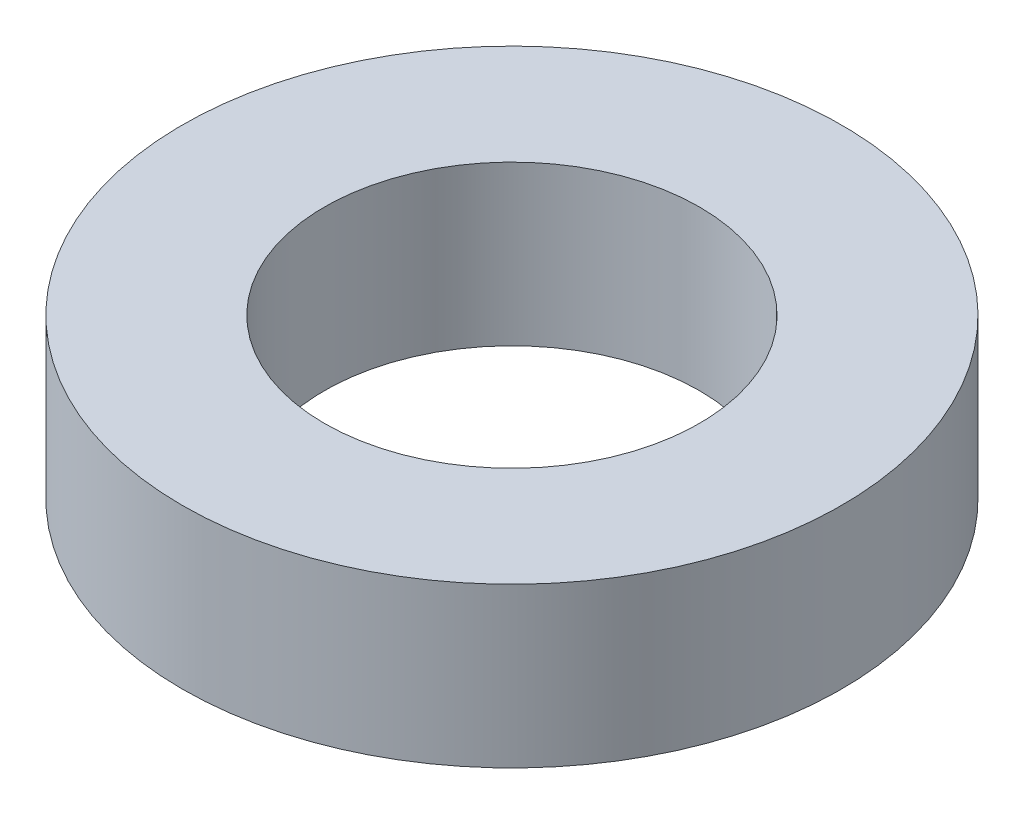
ISO-10303-21;
HEADER;
FILE_DESCRIPTION(('STEP AP214'),'2;1');
FILE_NAME('part.step','',(''),(''),'','','');
FILE_SCHEMA(('AUTOMOTIVE_DESIGN { 1 0 10303 214 1 1 1 1 }'));
ENDSEC;
DATA;
#1=APPLICATION_CONTEXT('core data for automotive mechanical design processes');
#2=APPLICATION_PROTOCOL_DEFINITION('international standard','automotive_design',2000,#1);
#3=PRODUCT_CONTEXT('',#1,'mechanical');
#4=PRODUCT('Part','Part','',(#3));
#5=PRODUCT_RELATED_PRODUCT_CATEGORY('part','',(#4));
#6=PRODUCT_DEFINITION_FORMATION('','',#4);
#7=PRODUCT_DEFINITION_CONTEXT('part definition',#1,'design');
#8=PRODUCT_DEFINITION('design','',#6,#7);
#9=PRODUCT_DEFINITION_SHAPE('','',#8);
#10=(LENGTH_UNIT() NAMED_UNIT(*) SI_UNIT(.MILLI.,.METRE.));
#11=(NAMED_UNIT(*) PLANE_ANGLE_UNIT() SI_UNIT($,.RADIAN.));
#12=(NAMED_UNIT(*) SI_UNIT($,.STERADIAN.) SOLID_ANGLE_UNIT());
#13=UNCERTAINTY_MEASURE_WITH_UNIT(LENGTH_MEASURE(1.E-05),#10,'distance_accuracy_value','');
#14=(GEOMETRIC_REPRESENTATION_CONTEXT(3) GLOBAL_UNCERTAINTY_ASSIGNED_CONTEXT((#13)) GLOBAL_UNIT_ASSIGNED_CONTEXT((#10,
#11,#12)) REPRESENTATION_CONTEXT('',''));
#15=CARTESIAN_POINT('',(0.,0.,0.));
#16=DIRECTION('',(0.,0.,1.));
#17=DIRECTION('',(1.,0.,0.));
#18=AXIS2_PLACEMENT_3D('',#15,#16,#17);
#19=CARTESIAN_POINT('',(0.,1.4,0.));
#20=DIRECTION('',(0.,1.,0.));
#21=DIRECTION('',(0.,0.,1.));
#22=AXIS2_PLACEMENT_3D('',#19,#20,#21);
#23=PLANE('',#22);
#24=CARTESIAN_POINT('',(0.,1.4,0.));
#25=DIRECTION('',(0.,1.,0.));
#26=DIRECTION('',(0.,0.,1.));
#27=AXIS2_PLACEMENT_3D('',#24,#25,#26);
#28=CIRCLE('',#27,2.9);
#29=CARTESIAN_POINT('',(0.,1.4,2.9));
#30=VERTEX_POINT('',#29);
#31=EDGE_CURVE('E10',#30,#30,#28,.T.);
#32=ORIENTED_EDGE('',*,*,#31,.T.);
#33=EDGE_LOOP('',(#32));
#34=FACE_BOUND('',#33,.T.);
#35=CARTESIAN_POINT('',(0.,1.4,0.));
#36=DIRECTION('',(0.,1.,0.));
#37=DIRECTION('',(0.,0.,1.));
#38=AXIS2_PLACEMENT_3D('',#35,#36,#37);
#39=CIRCLE('',#38,1.65);
#40=CARTESIAN_POINT('',(0.,1.4,1.65));
#41=VERTEX_POINT('',#40);
#42=EDGE_CURVE('E54',#41,#41,#39,.T.);
#43=ORIENTED_EDGE('',*,*,#42,.F.);
#44=EDGE_LOOP('',(#43));
#45=FACE_BOUND('',#44,.T.);
#46=ADVANCED_FACE('F41',(#34,#45),#23,.T.);
#47=CARTESIAN_POINT('',(0.,0.,0.));
#48=DIRECTION('',(0.,1.,0.));
#49=DIRECTION('',(0.,0.,1.));
#50=AXIS2_PLACEMENT_3D('',#47,#48,#49);
#51=PLANE('',#50);
#52=CARTESIAN_POINT('',(0.,0.,0.));
#53=DIRECTION('',(0.,1.,0.));
#54=DIRECTION('',(0.,0.,1.));
#55=AXIS2_PLACEMENT_3D('',#52,#53,#54);
#56=CIRCLE('',#55,2.9);
#57=CARTESIAN_POINT('',(0.,0.,2.9));
#58=VERTEX_POINT('',#57);
#59=EDGE_CURVE('E45',#58,#58,#56,.T.);
#60=ORIENTED_EDGE('',*,*,#59,.F.);
#61=EDGE_LOOP('',(#60));
#62=FACE_BOUND('',#61,.T.);
#63=CARTESIAN_POINT('',(0.,0.,0.));
#64=DIRECTION('',(0.,1.,0.));
#65=DIRECTION('',(0.,0.,1.));
#66=AXIS2_PLACEMENT_3D('',#63,#64,#65);
#67=CIRCLE('',#66,1.65);
#68=CARTESIAN_POINT('',(0.,0.,1.65));
#69=VERTEX_POINT('',#68);
#70=EDGE_CURVE('E56',#69,#69,#67,.T.);
#71=ORIENTED_EDGE('',*,*,#70,.T.);
#72=EDGE_LOOP('',(#71));
#73=FACE_BOUND('',#72,.T.);
#74=ADVANCED_FACE('F68',(#62,#73),#51,.F.);
#75=CARTESIAN_POINT('',(0.,1.4,0.));
#76=DIRECTION('',(0.,-1.,0.));
#77=DIRECTION('',(0.,0.,-1.));
#78=AXIS2_PLACEMENT_3D('',#75,#76,#77);
#79=CYLINDRICAL_SURFACE('',#78,2.9);
#80=ORIENTED_EDGE('',*,*,#31,.F.);
#81=EDGE_LOOP('',(#80));
#82=FACE_BOUND('',#81,.T.);
#83=ORIENTED_EDGE('',*,*,#59,.T.);
#84=EDGE_LOOP('',(#83));
#85=FACE_BOUND('',#84,.T.);
#86=ADVANCED_FACE('F43',(#82,#85),#79,.T.);
#87=CARTESIAN_POINT('',(0.,1.4,0.));
#88=DIRECTION('',(0.,-1.,0.));
#89=DIRECTION('',(0.,0.,-1.));
#90=AXIS2_PLACEMENT_3D('',#87,#88,#89);
#91=CYLINDRICAL_SURFACE('',#90,1.65);
#92=ORIENTED_EDGE('',*,*,#42,.T.);
#93=EDGE_LOOP('',(#92));
#94=FACE_BOUND('',#93,.T.);
#95=ORIENTED_EDGE('',*,*,#70,.F.);
#96=EDGE_LOOP('',(#95));
#97=FACE_BOUND('',#96,.T.);
#98=ADVANCED_FACE('F64',(#94,#97),#91,.F.);
#99=CLOSED_SHELL('',(#46,#74,#86,#98));
#100=MANIFOLD_SOLID_BREP('B2',#99);
#101=ADVANCED_BREP_SHAPE_REPRESENTATION('',(#18,#100),#14);
#102=SHAPE_DEFINITION_REPRESENTATION(#9,#101);
ENDSEC;
END-ISO-10303-21;
